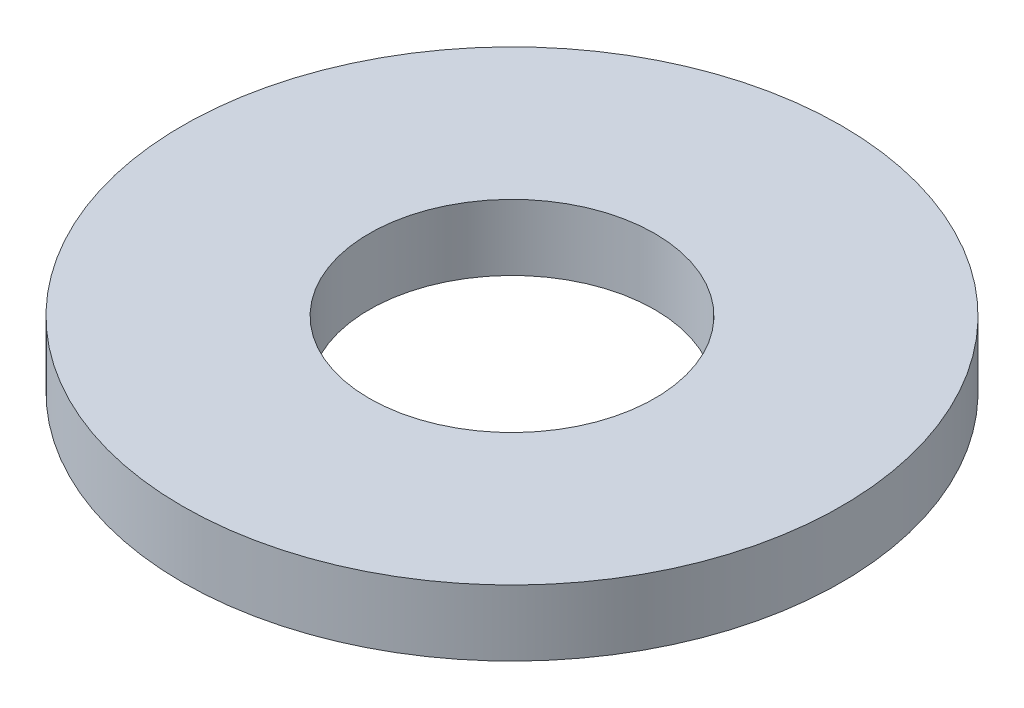
ISO-10303-21;
HEADER;
FILE_DESCRIPTION(('STEP AP214'),'2;1');
FILE_NAME('part.step','',(''),(''),'','','');
FILE_SCHEMA(('AUTOMOTIVE_DESIGN { 1 0 10303 214 1 1 1 1 }'));
ENDSEC;
DATA;
#1=APPLICATION_CONTEXT('core data for automotive mechanical design processes');
#2=APPLICATION_PROTOCOL_DEFINITION('international standard','automotive_design',2000,#1);
#3=PRODUCT_CONTEXT('',#1,'mechanical');
#4=PRODUCT('Part','Part','',(#3));
#5=PRODUCT_RELATED_PRODUCT_CATEGORY('part','',(#4));
#6=PRODUCT_DEFINITION_FORMATION('','',#4);
#7=PRODUCT_DEFINITION_CONTEXT('part definition',#1,'design');
#8=PRODUCT_DEFINITION('design','',#6,#7);
#9=PRODUCT_DEFINITION_SHAPE('','',#8);
#10=(LENGTH_UNIT() NAMED_UNIT(*) SI_UNIT(.MILLI.,.METRE.));
#11=(NAMED_UNIT(*) PLANE_ANGLE_UNIT() SI_UNIT($,.RADIAN.));
#12=(NAMED_UNIT(*) SI_UNIT($,.STERADIAN.) SOLID_ANGLE_UNIT());
#13=UNCERTAINTY_MEASURE_WITH_UNIT(LENGTH_MEASURE(1.E-05),#10,'distance_accuracy_value','');
#14=(GEOMETRIC_REPRESENTATION_CONTEXT(3) GLOBAL_UNCERTAINTY_ASSIGNED_CONTEXT((#13)) GLOBAL_UNIT_ASSIGNED_CONTEXT((#10,
#11,#12)) REPRESENTATION_CONTEXT('',''));
#15=CARTESIAN_POINT('',(0.,0.,0.));
#16=DIRECTION('',(0.,0.,1.));
#17=DIRECTION('',(1.,0.,0.));
#18=AXIS2_PLACEMENT_3D('',#15,#16,#17);
#19=CARTESIAN_POINT('',(0.,3.,0.));
#20=DIRECTION('',(0.,1.,0.));
#21=DIRECTION('',(0.,0.,1.));
#22=AXIS2_PLACEMENT_3D('',#19,#20,#21);
#23=PLANE('',#22);
#24=CARTESIAN_POINT('',(0.,3.,0.));
#25=DIRECTION('',(0.,1.,0.));
#26=DIRECTION('',(0.,0.,1.));
#27=AXIS2_PLACEMENT_3D('',#24,#25,#26);
#28=CIRCLE('',#27,15.);
#29=CARTESIAN_POINT('',(0.,3.,15.));
#30=VERTEX_POINT('',#29);
#31=EDGE_CURVE('E10',#30,#30,#28,.T.);
#32=ORIENTED_EDGE('',*,*,#31,.T.);
#33=EDGE_LOOP('',(#32));
#34=FACE_BOUND('',#33,.T.);
#35=CARTESIAN_POINT('',(0.,3.,0.));
#36=DIRECTION('',(0.,1.,0.));
#37=DIRECTION('',(0.,0.,1.));
#38=AXIS2_PLACEMENT_3D('',#35,#36,#37);
#39=CIRCLE('',#38,6.5);
#40=CARTESIAN_POINT('',(0.,3.,6.5));
#41=VERTEX_POINT('',#40);
#42=EDGE_CURVE('E41',#41,#41,#39,.T.);
#43=ORIENTED_EDGE('',*,*,#42,.F.);
#44=EDGE_LOOP('',(#43));
#45=FACE_BOUND('',#44,.T.);
#46=ADVANCED_FACE('F30',(#34,#45),#23,.T.);
#47=CARTESIAN_POINT('',(0.,0.,0.));
#48=DIRECTION('',(0.,1.,0.));
#49=DIRECTION('',(0.,0.,1.));
#50=AXIS2_PLACEMENT_3D('',#47,#48,#49);
#51=PLANE('',#50);
#52=CARTESIAN_POINT('',(0.,0.,0.));
#53=DIRECTION('',(0.,1.,0.));
#54=DIRECTION('',(0.,0.,1.));
#55=AXIS2_PLACEMENT_3D('',#52,#53,#54);
#56=CIRCLE('',#55,15.);
#57=CARTESIAN_POINT('',(0.,0.,15.));
#58=VERTEX_POINT('',#57);
#59=EDGE_CURVE('E34',#58,#58,#56,.T.);
#60=ORIENTED_EDGE('',*,*,#59,.F.);
#61=EDGE_LOOP('',(#60));
#62=FACE_BOUND('',#61,.T.);
#63=CARTESIAN_POINT('',(0.,0.,0.));
#64=DIRECTION('',(0.,1.,0.));
#65=DIRECTION('',(0.,0.,1.));
#66=AXIS2_PLACEMENT_3D('',#63,#64,#65);
#67=CIRCLE('',#66,6.5);
#68=CARTESIAN_POINT('',(0.,0.,6.5));
#69=VERTEX_POINT('',#68);
#70=EDGE_CURVE('E43',#69,#69,#67,.T.);
#71=ORIENTED_EDGE('',*,*,#70,.T.);
#72=EDGE_LOOP('',(#71));
#73=FACE_BOUND('',#72,.T.);
#74=ADVANCED_FACE('F53',(#62,#73),#51,.F.);
#75=CARTESIAN_POINT('',(0.,3.,0.));
#76=DIRECTION('',(0.,-1.,0.));
#77=DIRECTION('',(0.,0.,-1.));
#78=AXIS2_PLACEMENT_3D('',#75,#76,#77);
#79=CYLINDRICAL_SURFACE('',#78,15.);
#80=ORIENTED_EDGE('',*,*,#31,.F.);
#81=EDGE_LOOP('',(#80));
#82=FACE_BOUND('',#81,.T.);
#83=ORIENTED_EDGE('',*,*,#59,.T.);
#84=EDGE_LOOP('',(#83));
#85=FACE_BOUND('',#84,.T.);
#86=ADVANCED_FACE('F32',(#82,#85),#79,.T.);
#87=CARTESIAN_POINT('',(0.,3.,0.));
#88=DIRECTION('',(0.,-1.,0.));
#89=DIRECTION('',(0.,0.,-1.));
#90=AXIS2_PLACEMENT_3D('',#87,#88,#89);
#91=CYLINDRICAL_SURFACE('',#90,6.5);
#92=ORIENTED_EDGE('',*,*,#42,.T.);
#93=EDGE_LOOP('',(#92));
#94=FACE_BOUND('',#93,.T.);
#95=ORIENTED_EDGE('',*,*,#70,.F.);
#96=EDGE_LOOP('',(#95));
#97=FACE_BOUND('',#96,.T.);
#98=ADVANCED_FACE('F49',(#94,#97),#91,.F.);
#99=CLOSED_SHELL('',(#46,#74,#86,#98));
#100=MANIFOLD_SOLID_BREP('B2',#99);
#101=ADVANCED_BREP_SHAPE_REPRESENTATION('',(#18,#100),#14);
#102=SHAPE_DEFINITION_REPRESENTATION(#9,#101);
ENDSEC;
END-ISO-10303-21;
